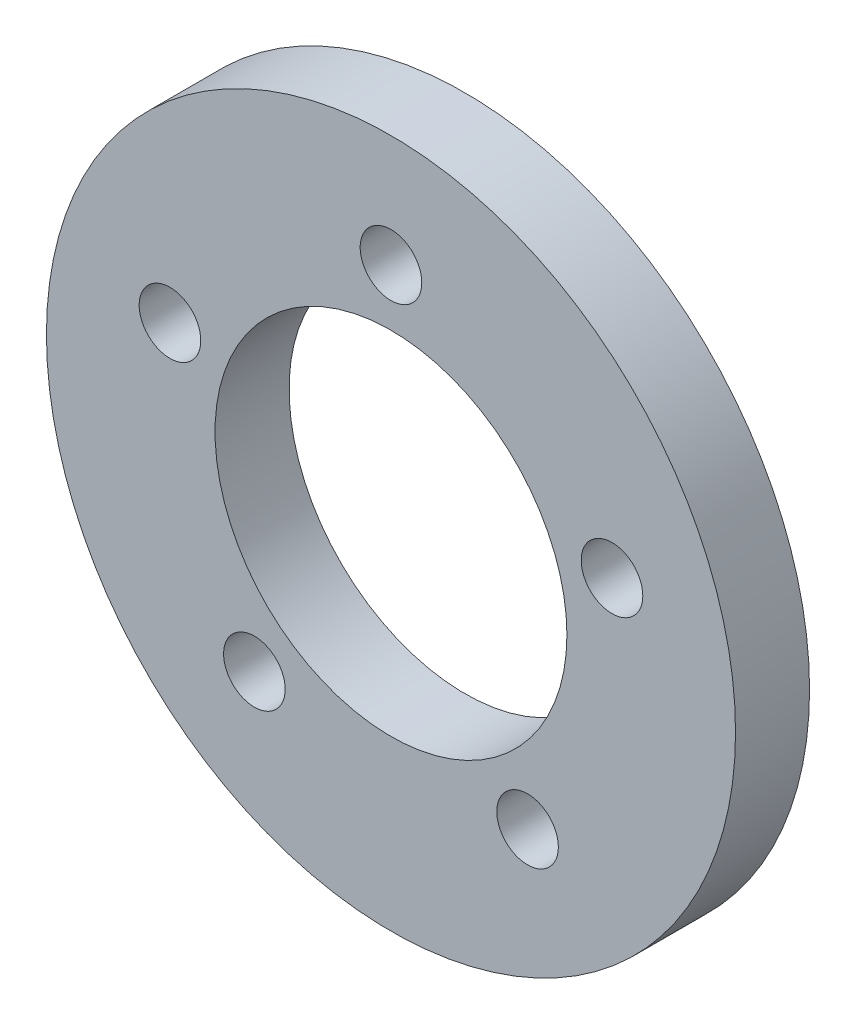
ISO-10303-21;
HEADER;
FILE_DESCRIPTION(('STEP AP214'),'2;1');
FILE_NAME('part.step','',(''),(''),'','','');
FILE_SCHEMA(('AUTOMOTIVE_DESIGN { 1 0 10303 214 1 1 1 1 }'));
ENDSEC;
DATA;
#1=APPLICATION_CONTEXT('core data for automotive mechanical design processes');
#2=APPLICATION_PROTOCOL_DEFINITION('international standard','automotive_design',2000,#1);
#3=PRODUCT_CONTEXT('',#1,'mechanical');
#4=PRODUCT('Part','Part','',(#3));
#5=PRODUCT_RELATED_PRODUCT_CATEGORY('part','',(#4));
#6=PRODUCT_DEFINITION_FORMATION('','',#4);
#7=PRODUCT_DEFINITION_CONTEXT('part definition',#1,'design');
#8=PRODUCT_DEFINITION('design','',#6,#7);
#9=PRODUCT_DEFINITION_SHAPE('','',#8);
#10=(LENGTH_UNIT() NAMED_UNIT(*) SI_UNIT(.MILLI.,.METRE.));
#11=(NAMED_UNIT(*) PLANE_ANGLE_UNIT() SI_UNIT($,.RADIAN.));
#12=(NAMED_UNIT(*) SI_UNIT($,.STERADIAN.) SOLID_ANGLE_UNIT());
#13=UNCERTAINTY_MEASURE_WITH_UNIT(LENGTH_MEASURE(1.E-05),#10,'distance_accuracy_value','');
#14=(GEOMETRIC_REPRESENTATION_CONTEXT(3) GLOBAL_UNCERTAINTY_ASSIGNED_CONTEXT((#13)) GLOBAL_UNIT_ASSIGNED_CONTEXT((#10,
#11,#12)) REPRESENTATION_CONTEXT('',''));
#15=CARTESIAN_POINT('',(0.,0.,0.));
#16=DIRECTION('',(0.,0.,1.));
#17=DIRECTION('',(1.,0.,0.));
#18=AXIS2_PLACEMENT_3D('',#15,#16,#17);
#19=CARTESIAN_POINT('',(0.,15.85,5.05));
#20=DIRECTION('',(0.,0.,-1.));
#21=DIRECTION('',(-1.,0.,0.));
#22=AXIS2_PLACEMENT_3D('',#19,#20,#21);
#23=CYLINDRICAL_SURFACE('',#22,2.1);
#24=CARTESIAN_POINT('',(0.,15.85,5.05));
#25=DIRECTION('',(0.,0.,1.));
#26=DIRECTION('',(1.,0.,0.));
#27=AXIS2_PLACEMENT_3D('',#24,#25,#26);
#28=CIRCLE('',#27,2.1);
#29=CARTESIAN_POINT('',(2.1,15.85,5.05));
#30=VERTEX_POINT('',#29);
#31=EDGE_CURVE('E40',#30,#30,#28,.T.);
#32=ORIENTED_EDGE('',*,*,#31,.T.);
#33=EDGE_LOOP('',(#32));
#34=FACE_BOUND('',#33,.T.);
#35=CARTESIAN_POINT('',(0.,15.85,0.));
#36=DIRECTION('',(0.,0.,1.));
#37=DIRECTION('',(1.,0.,0.));
#38=AXIS2_PLACEMENT_3D('',#35,#36,#37);
#39=CIRCLE('',#38,2.1);
#40=CARTESIAN_POINT('',(2.1,15.85,0.));
#41=VERTEX_POINT('',#40);
#42=EDGE_CURVE('E63',#41,#41,#39,.T.);
#43=ORIENTED_EDGE('',*,*,#42,.F.);
#44=EDGE_LOOP('',(#43));
#45=FACE_BOUND('',#44,.T.);
#46=ADVANCED_FACE('F32',(#34,#45),#23,.F.);
#47=CARTESIAN_POINT('',(15.0742457832782,4.89791936084287,5.05));
#48=DIRECTION('',(0.,0.,-1.));
#49=DIRECTION('',(-1.,0.,0.));
#50=AXIS2_PLACEMENT_3D('',#47,#48,#49);
#51=CYLINDRICAL_SURFACE('',#50,2.1);
#52=CARTESIAN_POINT('',(15.0742457832782,4.89791936084287,5.05));
#53=DIRECTION('',(0.,0.,1.));
#54=DIRECTION('',(1.,0.,0.));
#55=AXIS2_PLACEMENT_3D('',#52,#53,#54);
#56=CIRCLE('',#55,2.1);
#57=CARTESIAN_POINT('',(17.1742457832782,4.89791936084287,5.05));
#58=VERTEX_POINT('',#57);
#59=EDGE_CURVE('E45',#58,#58,#56,.T.);
#60=ORIENTED_EDGE('',*,*,#59,.T.);
#61=EDGE_LOOP('',(#60));
#62=FACE_BOUND('',#61,.T.);
#63=CARTESIAN_POINT('',(15.0742457832782,4.89791936084287,0.));
#64=DIRECTION('',(0.,0.,1.));
#65=DIRECTION('',(1.,0.,0.));
#66=AXIS2_PLACEMENT_3D('',#63,#64,#65);
#67=CIRCLE('',#66,2.1);
#68=CARTESIAN_POINT('',(17.1742457832782,4.89791936084287,0.));
#69=VERTEX_POINT('',#68);
#70=EDGE_CURVE('E61',#69,#69,#67,.T.);
#71=ORIENTED_EDGE('',*,*,#70,.F.);
#72=EDGE_LOOP('',(#71));
#73=FACE_BOUND('',#72,.T.);
#74=ADVANCED_FACE('F87',(#62,#73),#51,.F.);
#75=CARTESIAN_POINT('',(9.31639624883563,-12.822919360843,5.05));
#76=DIRECTION('',(0.,0.,-1.));
#77=DIRECTION('',(-1.,0.,0.));
#78=AXIS2_PLACEMENT_3D('',#75,#76,#77);
#79=CYLINDRICAL_SURFACE('',#78,2.1);
#80=CARTESIAN_POINT('',(9.31639624883563,-12.822919360843,5.05));
#81=DIRECTION('',(0.,0.,1.));
#82=DIRECTION('',(1.,0.,0.));
#83=AXIS2_PLACEMENT_3D('',#80,#81,#82);
#84=CIRCLE('',#83,2.1);
#85=CARTESIAN_POINT('',(11.4163962488356,-12.822919360843,5.05));
#86=VERTEX_POINT('',#85);
#87=EDGE_CURVE('E82',#86,#86,#84,.T.);
#88=ORIENTED_EDGE('',*,*,#87,.T.);
#89=EDGE_LOOP('',(#88));
#90=FACE_BOUND('',#89,.T.);
#91=CARTESIAN_POINT('',(9.31639624883563,-12.822919360843,0.));
#92=DIRECTION('',(0.,0.,1.));
#93=DIRECTION('',(1.,0.,0.));
#94=AXIS2_PLACEMENT_3D('',#91,#92,#93);
#95=CIRCLE('',#94,2.1);
#96=CARTESIAN_POINT('',(11.4163962488356,-12.822919360843,0.));
#97=VERTEX_POINT('',#96);
#98=EDGE_CURVE('E58',#97,#97,#95,.T.);
#99=ORIENTED_EDGE('',*,*,#98,.F.);
#100=EDGE_LOOP('',(#99));
#101=FACE_BOUND('',#100,.T.);
#102=ADVANCED_FACE('F105',(#90,#101),#79,.F.);
#103=CARTESIAN_POINT('',(-9.31639624883581,-12.8229193608428,5.05));
#104=DIRECTION('',(0.,0.,-1.));
#105=DIRECTION('',(-1.,0.,0.));
#106=AXIS2_PLACEMENT_3D('',#103,#104,#105);
#107=CYLINDRICAL_SURFACE('',#106,2.1);
#108=CARTESIAN_POINT('',(-9.31639624883581,-12.8229193608428,5.05));
#109=DIRECTION('',(0.,0.,1.));
#110=DIRECTION('',(1.,0.,0.));
#111=AXIS2_PLACEMENT_3D('',#108,#109,#110);
#112=CIRCLE('',#111,2.1);
#113=CARTESIAN_POINT('',(-7.21639624883581,-12.8229193608428,5.05));
#114=VERTEX_POINT('',#113);
#115=EDGE_CURVE('E77',#114,#114,#112,.T.);
#116=ORIENTED_EDGE('',*,*,#115,.T.);
#117=EDGE_LOOP('',(#116));
#118=FACE_BOUND('',#117,.T.);
#119=CARTESIAN_POINT('',(-9.31639624883581,-12.8229193608428,0.));
#120=DIRECTION('',(0.,0.,1.));
#121=DIRECTION('',(1.,0.,0.));
#122=AXIS2_PLACEMENT_3D('',#119,#120,#121);
#123=CIRCLE('',#122,2.1);
#124=CARTESIAN_POINT('',(-7.21639624883581,-12.8229193608428,0.));
#125=VERTEX_POINT('',#124);
#126=EDGE_CURVE('E55',#125,#125,#123,.T.);
#127=ORIENTED_EDGE('',*,*,#126,.F.);
#128=EDGE_LOOP('',(#127));
#129=FACE_BOUND('',#128,.T.);
#130=ADVANCED_FACE('F112',(#118,#129),#107,.F.);
#131=CARTESIAN_POINT('',(-15.0742457832781,4.89791936084309,5.05));
#132=DIRECTION('',(0.,0.,-1.));
#133=DIRECTION('',(-1.,0.,0.));
#134=AXIS2_PLACEMENT_3D('',#131,#132,#133);
#135=CYLINDRICAL_SURFACE('',#134,2.1);
#136=CARTESIAN_POINT('',(-15.0742457832781,4.89791936084309,5.05));
#137=DIRECTION('',(0.,0.,1.));
#138=DIRECTION('',(1.,0.,0.));
#139=AXIS2_PLACEMENT_3D('',#136,#137,#138);
#140=CIRCLE('',#139,2.1);
#141=CARTESIAN_POINT('',(-12.9742457832781,4.89791936084309,5.05));
#142=VERTEX_POINT('',#141);
#143=EDGE_CURVE('E72',#142,#142,#140,.T.);
#144=ORIENTED_EDGE('',*,*,#143,.T.);
#145=EDGE_LOOP('',(#144));
#146=FACE_BOUND('',#145,.T.);
#147=CARTESIAN_POINT('',(-15.0742457832781,4.89791936084309,0.));
#148=DIRECTION('',(0.,0.,1.));
#149=DIRECTION('',(1.,0.,0.));
#150=AXIS2_PLACEMENT_3D('',#147,#148,#149);
#151=CIRCLE('',#150,2.1);
#152=CARTESIAN_POINT('',(-12.9742457832781,4.89791936084309,0.));
#153=VERTEX_POINT('',#152);
#154=EDGE_CURVE('E52',#153,#153,#151,.T.);
#155=ORIENTED_EDGE('',*,*,#154,.F.);
#156=EDGE_LOOP('',(#155));
#157=FACE_BOUND('',#156,.T.);
#158=ADVANCED_FACE('F115',(#146,#157),#135,.F.);
#159=CARTESIAN_POINT('',(0.,0.,5.05));
#160=DIRECTION('',(0.,0.,-1.));
#161=DIRECTION('',(-1.,0.,0.));
#162=AXIS2_PLACEMENT_3D('',#159,#160,#161);
#163=CYLINDRICAL_SURFACE('',#162,12.);
#164=CARTESIAN_POINT('',(0.,0.,5.05));
#165=DIRECTION('',(0.,0.,1.));
#166=DIRECTION('',(1.,0.,0.));
#167=AXIS2_PLACEMENT_3D('',#164,#165,#166);
#168=CIRCLE('',#167,12.);
#169=CARTESIAN_POINT('',(12.,0.,5.05));
#170=VERTEX_POINT('',#169);
#171=EDGE_CURVE('E68',#170,#170,#168,.T.);
#172=ORIENTED_EDGE('',*,*,#171,.T.);
#173=EDGE_LOOP('',(#172));
#174=FACE_BOUND('',#173,.T.);
#175=CARTESIAN_POINT('',(0.,0.,0.));
#176=DIRECTION('',(0.,0.,1.));
#177=DIRECTION('',(1.,0.,0.));
#178=AXIS2_PLACEMENT_3D('',#175,#176,#177);
#179=CIRCLE('',#178,12.);
#180=CARTESIAN_POINT('',(12.,0.,0.));
#181=VERTEX_POINT('',#180);
#182=EDGE_CURVE('E49',#181,#181,#179,.T.);
#183=ORIENTED_EDGE('',*,*,#182,.F.);
#184=EDGE_LOOP('',(#183));
#185=FACE_BOUND('',#184,.T.);
#186=ADVANCED_FACE('F34',(#174,#185),#163,.F.);
#187=CARTESIAN_POINT('',(0.,0.,5.05));
#188=DIRECTION('',(0.,0.,-1.));
#189=DIRECTION('',(-1.,0.,0.));
#190=AXIS2_PLACEMENT_3D('',#187,#188,#189);
#191=CYLINDRICAL_SURFACE('',#190,23.5);
#192=CARTESIAN_POINT('',(0.,0.,5.05));
#193=DIRECTION('',(0.,0.,1.));
#194=DIRECTION('',(1.,0.,0.));
#195=AXIS2_PLACEMENT_3D('',#192,#193,#194);
#196=CIRCLE('',#195,23.5);
#197=CARTESIAN_POINT('',(23.5,0.,5.05));
#198=VERTEX_POINT('',#197);
#199=EDGE_CURVE('E10',#198,#198,#196,.T.);
#200=ORIENTED_EDGE('',*,*,#199,.F.);
#201=EDGE_LOOP('',(#200));
#202=FACE_BOUND('',#201,.T.);
#203=CARTESIAN_POINT('',(0.,0.,0.));
#204=DIRECTION('',(0.,0.,1.));
#205=DIRECTION('',(1.,0.,0.));
#206=AXIS2_PLACEMENT_3D('',#203,#204,#205);
#207=CIRCLE('',#206,23.5);
#208=CARTESIAN_POINT('',(23.5,0.,0.));
#209=VERTEX_POINT('',#208);
#210=EDGE_CURVE('E36',#209,#209,#207,.T.);
#211=ORIENTED_EDGE('',*,*,#210,.T.);
#212=EDGE_LOOP('',(#211));
#213=FACE_BOUND('',#212,.T.);
#214=ADVANCED_FACE('F94',(#202,#213),#191,.T.);
#215=CARTESIAN_POINT('',(0.,0.,5.05));
#216=DIRECTION('',(0.,0.,1.));
#217=DIRECTION('',(1.,0.,0.));
#218=AXIS2_PLACEMENT_3D('',#215,#216,#217);
#219=PLANE('',#218);
#220=ORIENTED_EDGE('',*,*,#171,.F.);
#221=EDGE_LOOP('',(#220));
#222=FACE_BOUND('',#221,.T.);
#223=ORIENTED_EDGE('',*,*,#143,.F.);
#224=EDGE_LOOP('',(#223));
#225=FACE_BOUND('',#224,.T.);
#226=ORIENTED_EDGE('',*,*,#115,.F.);
#227=EDGE_LOOP('',(#226));
#228=FACE_BOUND('',#227,.T.);
#229=ORIENTED_EDGE('',*,*,#87,.F.);
#230=EDGE_LOOP('',(#229));
#231=FACE_BOUND('',#230,.T.);
#232=ORIENTED_EDGE('',*,*,#59,.F.);
#233=EDGE_LOOP('',(#232));
#234=FACE_BOUND('',#233,.T.);
#235=ORIENTED_EDGE('',*,*,#31,.F.);
#236=EDGE_LOOP('',(#235));
#237=FACE_BOUND('',#236,.T.);
#238=ORIENTED_EDGE('',*,*,#199,.T.);
#239=EDGE_LOOP('',(#238));
#240=FACE_BOUND('',#239,.T.);
#241=ADVANCED_FACE('F90',(#222,#225,#228,#231,#234,#237,#240),#219,.T.);
#242=CARTESIAN_POINT('',(0.,0.,0.));
#243=DIRECTION('',(0.,0.,1.));
#244=DIRECTION('',(1.,0.,0.));
#245=AXIS2_PLACEMENT_3D('',#242,#243,#244);
#246=PLANE('',#245);
#247=ORIENTED_EDGE('',*,*,#182,.T.);
#248=EDGE_LOOP('',(#247));
#249=FACE_BOUND('',#248,.T.);
#250=ORIENTED_EDGE('',*,*,#154,.T.);
#251=EDGE_LOOP('',(#250));
#252=FACE_BOUND('',#251,.T.);
#253=ORIENTED_EDGE('',*,*,#126,.T.);
#254=EDGE_LOOP('',(#253));
#255=FACE_BOUND('',#254,.T.);
#256=ORIENTED_EDGE('',*,*,#98,.T.);
#257=EDGE_LOOP('',(#256));
#258=FACE_BOUND('',#257,.T.);
#259=ORIENTED_EDGE('',*,*,#70,.T.);
#260=EDGE_LOOP('',(#259));
#261=FACE_BOUND('',#260,.T.);
#262=ORIENTED_EDGE('',*,*,#42,.T.);
#263=EDGE_LOOP('',(#262));
#264=FACE_BOUND('',#263,.T.);
#265=ORIENTED_EDGE('',*,*,#210,.F.);
#266=EDGE_LOOP('',(#265));
#267=FACE_BOUND('',#266,.T.);
#268=ADVANCED_FACE('F93',(#249,#252,#255,#258,#261,#264,#267),#246,.F.);
#269=CLOSED_SHELL('',(#46,#74,#102,#130,#158,#186,#214,#241,#268));
#270=MANIFOLD_SOLID_BREP('B2',#269);
#271=ADVANCED_BREP_SHAPE_REPRESENTATION('',(#18,#270),#14);
#272=SHAPE_DEFINITION_REPRESENTATION(#9,#271);
ENDSEC;
END-ISO-10303-21;
